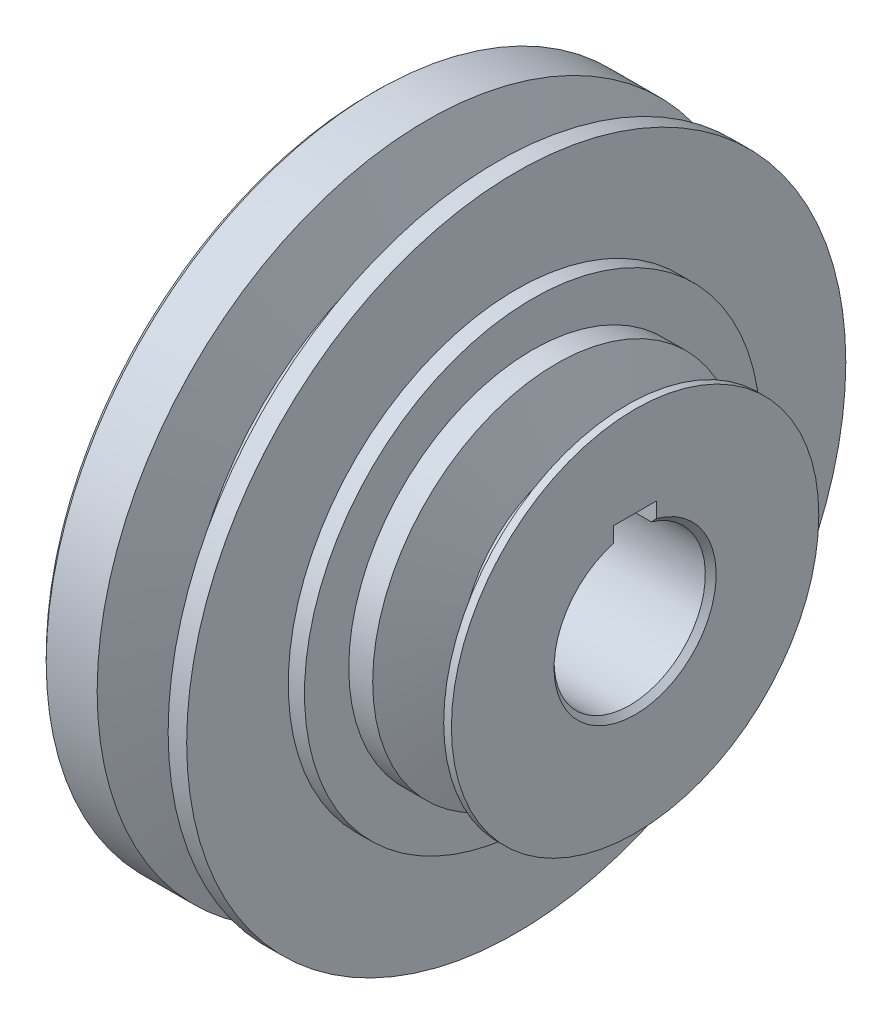
ISO-10303-21;
HEADER;
FILE_DESCRIPTION(('STEP AP214'),'2;1');
FILE_NAME('part.step','',(''),(''),'','','');
FILE_SCHEMA(('AUTOMOTIVE_DESIGN { 1 0 10303 214 1 1 1 1 }'));
ENDSEC;
DATA;
#1=APPLICATION_CONTEXT('core data for automotive mechanical design processes');
#2=APPLICATION_PROTOCOL_DEFINITION('international standard','automotive_design',2000,#1);
#3=PRODUCT_CONTEXT('',#1,'mechanical');
#4=PRODUCT('Part','Part','',(#3));
#5=PRODUCT_RELATED_PRODUCT_CATEGORY('part','',(#4));
#6=PRODUCT_DEFINITION_FORMATION('','',#4);
#7=PRODUCT_DEFINITION_CONTEXT('part definition',#1,'design');
#8=PRODUCT_DEFINITION('design','',#6,#7);
#9=PRODUCT_DEFINITION_SHAPE('','',#8);
#10=(LENGTH_UNIT() NAMED_UNIT(*) SI_UNIT(.MILLI.,.METRE.));
#11=(NAMED_UNIT(*) PLANE_ANGLE_UNIT() SI_UNIT($,.RADIAN.));
#12=(NAMED_UNIT(*) SI_UNIT($,.STERADIAN.) SOLID_ANGLE_UNIT());
#13=UNCERTAINTY_MEASURE_WITH_UNIT(LENGTH_MEASURE(1.E-05),#10,'distance_accuracy_value','');
#14=(GEOMETRIC_REPRESENTATION_CONTEXT(3) GLOBAL_UNCERTAINTY_ASSIGNED_CONTEXT((#13)) GLOBAL_UNIT_ASSIGNED_CONTEXT((#10,
#11,#12)) REPRESENTATION_CONTEXT('',''));
#15=CARTESIAN_POINT('',(0.,0.,0.));
#16=DIRECTION('',(0.,0.,1.));
#17=DIRECTION('',(1.,0.,0.));
#18=AXIS2_PLACEMENT_3D('',#15,#16,#17);
#19=CARTESIAN_POINT('',(32.,0.,0.));
#20=DIRECTION('',(-1.,0.,0.));
#21=DIRECTION('',(0.,0.,1.));
#22=AXIS2_PLACEMENT_3D('',#19,#20,#21);
#23=CYLINDRICAL_SURFACE('',#22,34.);
#24=CARTESIAN_POINT('',(13.,0.,0.));
#25=DIRECTION('',(1.,0.,0.));
#26=DIRECTION('',(0.,0.,-1.));
#27=AXIS2_PLACEMENT_3D('',#24,#25,#26);
#28=CIRCLE('',#27,34.);
#29=CARTESIAN_POINT('',(13.,0.,-34.));
#30=VERTEX_POINT('',#29);
#31=EDGE_CURVE('E198',#30,#30,#28,.T.);
#32=ORIENTED_EDGE('',*,*,#31,.T.);
#33=EDGE_LOOP('',(#32));
#34=FACE_BOUND('',#33,.T.);
#35=CARTESIAN_POINT('',(17.4299426148947,0.,0.));
#36=DIRECTION('',(-1.,0.,0.));
#37=DIRECTION('',(0.,0.,1.));
#38=AXIS2_PLACEMENT_3D('',#35,#36,#37);
#39=CIRCLE('',#38,34.);
#40=CARTESIAN_POINT('',(17.4299426148947,0.,34.));
#41=VERTEX_POINT('',#40);
#42=EDGE_CURVE('E189',#41,#41,#39,.T.);
#43=ORIENTED_EDGE('',*,*,#42,.T.);
#44=EDGE_LOOP('',(#43));
#45=FACE_BOUND('',#44,.T.);
#46=ADVANCED_FACE('F49',(#34,#45),#23,.T.);
#47=CARTESIAN_POINT('',(10.,0.,0.));
#48=DIRECTION('',(-1.,0.,0.));
#49=DIRECTION('',(0.,0.,1.));
#50=AXIS2_PLACEMENT_3D('',#47,#48,#49);
#51=CYLINDRICAL_SURFACE('',#50,61.);
#52=CARTESIAN_POINT('',(10.,0.,0.));
#53=DIRECTION('',(1.,0.,0.));
#54=DIRECTION('',(0.,0.,-1.));
#55=AXIS2_PLACEMENT_3D('',#52,#53,#54);
#56=CIRCLE('',#55,61.);
#57=CARTESIAN_POINT('',(10.,0.,-61.));
#58=VERTEX_POINT('',#57);
#59=EDGE_CURVE('E254',#58,#58,#56,.T.);
#60=ORIENTED_EDGE('',*,*,#59,.F.);
#61=EDGE_LOOP('',(#60));
#62=FACE_BOUND('',#61,.T.);
#63=CARTESIAN_POINT('',(6.57005738510532,0.,0.));
#64=DIRECTION('',(-1.,0.,0.));
#65=DIRECTION('',(0.,0.,1.));
#66=AXIS2_PLACEMENT_3D('',#63,#64,#65);
#67=CIRCLE('',#66,61.);
#68=CARTESIAN_POINT('',(6.57005738510532,0.,61.));
#69=VERTEX_POINT('',#68);
#70=EDGE_CURVE('E266',#69,#69,#67,.T.);
#71=ORIENTED_EDGE('',*,*,#70,.F.);
#72=EDGE_LOOP('',(#71));
#73=FACE_BOUND('',#72,.T.);
#74=ADVANCED_FACE('F311',(#62,#73),#51,.T.);
#75=CARTESIAN_POINT('',(10.,0.,0.));
#76=DIRECTION('',(1.,0.,0.));
#77=DIRECTION('',(0.,0.,-1.));
#78=AXIS2_PLACEMENT_3D('',#75,#76,#77);
#79=PLANE('',#78);
#80=CARTESIAN_POINT('',(10.,0.,0.));
#81=DIRECTION('',(1.,0.,0.));
#82=DIRECTION('',(0.,0.,-1.));
#83=AXIS2_PLACEMENT_3D('',#80,#81,#82);
#84=CIRCLE('',#83,42.1959290502496);
#85=CARTESIAN_POINT('',(10.,0.,-42.1959290502496));
#86=VERTEX_POINT('',#85);
#87=EDGE_CURVE('E202',#86,#86,#84,.T.);
#88=ORIENTED_EDGE('',*,*,#87,.F.);
#89=EDGE_LOOP('',(#88));
#90=FACE_BOUND('',#89,.T.);
#91=ORIENTED_EDGE('',*,*,#59,.T.);
#92=EDGE_LOOP('',(#91));
#93=FACE_BOUND('',#92,.T.);
#94=ADVANCED_FACE('F376',(#90,#93),#79,.T.);
#95=CARTESIAN_POINT('',(2.74842386687205,0.,0.));
#96=DIRECTION('',(1.,0.,0.));
#97=DIRECTION('',(0.,0.,-1.));
#98=AXIS2_PLACEMENT_3D('',#95,#96,#97);
#99=CONICAL_SURFACE('',#98,48.5,1.27409035395586);
#100=ORIENTED_EDGE('',*,*,#70,.T.);
#101=EDGE_LOOP('',(#100));
#102=FACE_BOUND('',#101,.T.);
#103=CARTESIAN_POINT('',(2.74842386687205,0.,0.));
#104=DIRECTION('',(-1.,0.,0.));
#105=DIRECTION('',(0.,0.,1.));
#106=AXIS2_PLACEMENT_3D('',#103,#104,#105);
#107=CIRCLE('',#106,48.5);
#108=CARTESIAN_POINT('',(2.74842386687205,0.,48.5));
#109=VERTEX_POINT('',#108);
#110=EDGE_CURVE('E262',#109,#109,#107,.T.);
#111=ORIENTED_EDGE('',*,*,#110,.F.);
#112=EDGE_LOOP('',(#111));
#113=FACE_BOUND('',#112,.T.);
#114=ADVANCED_FACE('F372',(#102,#113),#99,.T.);
#115=CARTESIAN_POINT('',(0.,0.,0.));
#116=DIRECTION('',(-1.,0.,0.));
#117=DIRECTION('',(0.,0.,1.));
#118=AXIS2_PLACEMENT_3D('',#115,#116,#117);
#119=CYLINDRICAL_SURFACE('',#118,48.5);
#120=ORIENTED_EDGE('',*,*,#110,.T.);
#121=EDGE_LOOP('',(#120));
#122=FACE_BOUND('',#121,.T.);
#123=CARTESIAN_POINT('',(-2.74842386687205,0.,0.));
#124=DIRECTION('',(-1.,0.,0.));
#125=DIRECTION('',(0.,0.,1.));
#126=AXIS2_PLACEMENT_3D('',#123,#124,#125);
#127=CIRCLE('',#126,48.5);
#128=CARTESIAN_POINT('',(-2.74842386687205,0.,48.5));
#129=VERTEX_POINT('',#128);
#130=EDGE_CURVE('E258',#129,#129,#127,.T.);
#131=ORIENTED_EDGE('',*,*,#130,.F.);
#132=EDGE_LOOP('',(#131));
#133=FACE_BOUND('',#132,.T.);
#134=ADVANCED_FACE('F368',(#122,#133),#119,.T.);
#135=CARTESIAN_POINT('',(-6.57005738510532,0.,0.));
#136=DIRECTION('',(-1.,0.,0.));
#137=DIRECTION('',(0.,0.,1.));
#138=AXIS2_PLACEMENT_3D('',#135,#136,#137);
#139=CONICAL_SURFACE('',#138,61.,1.27409035395586);
#140=ORIENTED_EDGE('',*,*,#130,.T.);
#141=EDGE_LOOP('',(#140));
#142=FACE_BOUND('',#141,.T.);
#143=CARTESIAN_POINT('',(-6.57005738510532,0.,0.));
#144=DIRECTION('',(-1.,0.,0.));
#145=DIRECTION('',(0.,0.,1.));
#146=AXIS2_PLACEMENT_3D('',#143,#144,#145);
#147=CIRCLE('',#146,61.);
#148=CARTESIAN_POINT('',(-6.57005738510532,0.,61.));
#149=VERTEX_POINT('',#148);
#150=EDGE_CURVE('E250',#149,#149,#147,.T.);
#151=ORIENTED_EDGE('',*,*,#150,.F.);
#152=EDGE_LOOP('',(#151));
#153=FACE_BOUND('',#152,.T.);
#154=ADVANCED_FACE('F364',(#142,#153),#139,.T.);
#155=CARTESIAN_POINT('',(-17.,0.,0.));
#156=DIRECTION('',(1.,0.,0.));
#157=DIRECTION('',(0.,0.,-1.));
#158=AXIS2_PLACEMENT_3D('',#155,#156,#157);
#159=PLANE('',#158);
#160=CARTESIAN_POINT('',(-17.,0.,0.));
#161=DIRECTION('',(1.,0.,0.));
#162=DIRECTION('',(0.,0.,-1.));
#163=AXIS2_PLACEMENT_3D('',#160,#161,#162);
#164=CIRCLE('',#163,60.);
#165=CARTESIAN_POINT('',(-17.,0.,-60.));
#166=VERTEX_POINT('',#165);
#167=EDGE_CURVE('E11',#166,#166,#164,.F.);
#168=ORIENTED_EDGE('',*,*,#167,.T.);
#169=EDGE_LOOP('',(#168));
#170=FACE_BOUND('',#169,.T.);
#171=CARTESIAN_POINT('',(-17.,36.5,0.));
#172=DIRECTION('',(-1.,0.,0.));
#173=DIRECTION('',(0.,0.,1.));
#174=AXIS2_PLACEMENT_3D('',#171,#172,#173);
#175=CIRCLE('',#174,4.24999999999999);
#176=CARTESIAN_POINT('',(-17.,36.5,4.24999999999999));
#177=VERTEX_POINT('',#176);
#178=EDGE_CURVE('E206',#177,#177,#175,.T.);
#179=ORIENTED_EDGE('',*,*,#178,.F.);
#180=EDGE_LOOP('',(#179));
#181=FACE_BOUND('',#180,.T.);
#182=CARTESIAN_POINT('',(-17.,-36.5,0.));
#183=DIRECTION('',(-1.,0.,0.));
#184=DIRECTION('',(0.,0.,1.));
#185=AXIS2_PLACEMENT_3D('',#182,#183,#184);
#186=CIRCLE('',#185,4.24999999999999);
#187=CARTESIAN_POINT('',(-17.,-36.5,4.24999999999999));
#188=VERTEX_POINT('',#187);
#189=EDGE_CURVE('E218',#188,#188,#186,.T.);
#190=ORIENTED_EDGE('',*,*,#189,.F.);
#191=EDGE_LOOP('',(#190));
#192=FACE_BOUND('',#191,.T.);
#193=CARTESIAN_POINT('',(-17.,0.,0.));
#194=DIRECTION('',(-1.,0.,0.));
#195=DIRECTION('',(0.,0.,1.));
#196=AXIS2_PLACEMENT_3D('',#193,#194,#195);
#197=CIRCLE('',#196,25.);
#198=CARTESIAN_POINT('',(-17.,0.,25.));
#199=VERTEX_POINT('',#198);
#200=EDGE_CURVE('E246',#199,#199,#197,.T.);
#201=ORIENTED_EDGE('',*,*,#200,.F.);
#202=EDGE_LOOP('',(#201));
#203=FACE_BOUND('',#202,.T.);
#204=ADVANCED_FACE('F367',(#170,#181,#192,#203),#159,.F.);
#205=CARTESIAN_POINT('',(-16.,0.,0.));
#206=DIRECTION('',(1.,0.,0.));
#207=DIRECTION('',(0.,0.,-1.));
#208=AXIS2_PLACEMENT_3D('',#205,#206,#207);
#209=CIRCLE('',#208,61.);
#210=CARTESIAN_POINT('',(-16.,0.,-61.));
#211=VERTEX_POINT('',#210);
#212=EDGE_CURVE('E59',#211,#211,#209,.T.);
#213=ORIENTED_EDGE('',*,*,#212,.T.);
#214=EDGE_LOOP('',(#213));
#215=FACE_BOUND('',#214,.T.);
#216=ORIENTED_EDGE('',*,*,#150,.T.);
#217=EDGE_LOOP('',(#216));
#218=FACE_BOUND('',#217,.T.);
#219=ADVANCED_FACE('F362',(#215,#218),#51,.T.);
#220=CARTESIAN_POINT('',(-36.,0.,0.));
#221=DIRECTION('',(1.,0.,0.));
#222=DIRECTION('',(0.,0.,-1.));
#223=AXIS2_PLACEMENT_3D('',#220,#221,#222);
#224=CYLINDRICAL_SURFACE('',#223,25.);
#225=CARTESIAN_POINT('',(-36.,0.,0.));
#226=DIRECTION('',(-1.,0.,0.));
#227=DIRECTION('',(0.,0.,1.));
#228=AXIS2_PLACEMENT_3D('',#225,#226,#227);
#229=CIRCLE('',#228,25.);
#230=CARTESIAN_POINT('',(-36.,0.,25.));
#231=VERTEX_POINT('',#230);
#232=EDGE_CURVE('E242',#231,#231,#229,.T.);
#233=ORIENTED_EDGE('',*,*,#232,.F.);
#234=EDGE_LOOP('',(#233));
#235=FACE_BOUND('',#234,.T.);
#236=ORIENTED_EDGE('',*,*,#200,.T.);
#237=EDGE_LOOP('',(#236));
#238=FACE_BOUND('',#237,.T.);
#239=ADVANCED_FACE('F358',(#235,#238),#224,.T.);
#240=CARTESIAN_POINT('',(-36.,0.,0.));
#241=DIRECTION('',(-1.,0.,0.));
#242=DIRECTION('',(0.,0.,1.));
#243=AXIS2_PLACEMENT_3D('',#240,#241,#242);
#244=PLANE('',#243);
#245=CARTESIAN_POINT('',(-36.,0.,0.));
#246=DIRECTION('',(-1.,0.,0.));
#247=DIRECTION('',(0.,0.,1.));
#248=AXIS2_PLACEMENT_3D('',#245,#246,#247);
#249=CIRCLE('',#248,21.);
#250=CARTESIAN_POINT('',(-36.,0.,21.));
#251=VERTEX_POINT('',#250);
#252=EDGE_CURVE('E210',#251,#251,#249,.T.);
#253=ORIENTED_EDGE('',*,*,#252,.F.);
#254=EDGE_LOOP('',(#253));
#255=FACE_BOUND('',#254,.T.);
#256=ORIENTED_EDGE('',*,*,#232,.T.);
#257=EDGE_LOOP('',(#256));
#258=FACE_BOUND('',#257,.T.);
#259=ADVANCED_FACE('F354',(#255,#258),#244,.T.);
#260=CARTESIAN_POINT('',(-42.,0.,0.));
#261=DIRECTION('',(1.,0.,0.));
#262=DIRECTION('',(0.,0.,-1.));
#263=AXIS2_PLACEMENT_3D('',#260,#261,#262);
#264=CYLINDRICAL_SURFACE('',#263,21.);
#265=CARTESIAN_POINT('',(-42.,0.,0.));
#266=DIRECTION('',(-1.,0.,0.));
#267=DIRECTION('',(0.,0.,1.));
#268=AXIS2_PLACEMENT_3D('',#265,#266,#267);
#269=CIRCLE('',#268,21.);
#270=CARTESIAN_POINT('',(-42.,0.,21.));
#271=VERTEX_POINT('',#270);
#272=EDGE_CURVE('E235',#271,#271,#269,.T.);
#273=ORIENTED_EDGE('',*,*,#272,.F.);
#274=EDGE_LOOP('',(#273));
#275=FACE_BOUND('',#274,.T.);
#276=ORIENTED_EDGE('',*,*,#252,.T.);
#277=EDGE_LOOP('',(#276));
#278=FACE_BOUND('',#277,.T.);
#279=ADVANCED_FACE('F350',(#275,#278),#264,.T.);
#280=CARTESIAN_POINT('',(-42.,0.,0.));
#281=DIRECTION('',(-1.,0.,0.));
#282=DIRECTION('',(0.,0.,1.));
#283=AXIS2_PLACEMENT_3D('',#280,#281,#282);
#284=PLANE('',#283);
#285=DIRECTION('',(0.,1.,0.));
#286=VECTOR('',#285,1.);
#287=CARTESIAN_POINT('',(-42.,17.3,4.));
#288=LINE('',#287,#286);
#289=CARTESIAN_POINT('',(-42.,15.6984075625523,4.));
#290=VERTEX_POINT('',#289);
#291=CARTESIAN_POINT('',(-42.,17.3,4.));
#292=VERTEX_POINT('',#291);
#293=EDGE_CURVE('E132',#290,#292,#288,.T.);
#294=ORIENTED_EDGE('',*,*,#293,.F.);
#295=CARTESIAN_POINT('',(-42.,0.,0.));
#296=DIRECTION('',(-1.,0.,0.));
#297=DIRECTION('',(0.,0.,1.));
#298=AXIS2_PLACEMENT_3D('',#295,#296,#297);
#299=CIRCLE('',#298,16.2);
#300=CARTESIAN_POINT('',(-42.,15.6984075625523,-4.));
#301=VERTEX_POINT('',#300);
#302=EDGE_CURVE('E230',#301,#290,#299,.T.);
#303=ORIENTED_EDGE('',*,*,#302,.F.);
#304=DIRECTION('',(0.,-1.,0.));
#305=VECTOR('',#304,1.);
#306=CARTESIAN_POINT('',(-42.,17.3,-4.));
#307=LINE('',#306,#305);
#308=CARTESIAN_POINT('',(-42.,17.3,-4.));
#309=VERTEX_POINT('',#308);
#310=EDGE_CURVE('E126',#309,#301,#307,.T.);
#311=ORIENTED_EDGE('',*,*,#310,.F.);
#312=DIRECTION('',(0.,0.,-1.));
#313=VECTOR('',#312,1.);
#314=CARTESIAN_POINT('',(-42.,17.3,-4.));
#315=LINE('',#314,#313);
#316=EDGE_CURVE('E149',#292,#309,#315,.T.);
#317=ORIENTED_EDGE('',*,*,#316,.F.);
#318=EDGE_LOOP('',(#294,#303,#311,#317));
#319=FACE_BOUND('',#318,.T.);
#320=ORIENTED_EDGE('',*,*,#272,.T.);
#321=EDGE_LOOP('',(#320));
#322=FACE_BOUND('',#321,.T.);
#323=ADVANCED_FACE('F346',(#319,#322),#284,.T.);
#324=CARTESIAN_POINT('',(-31.,0.,0.));
#325=DIRECTION('',(-1.,0.,0.));
#326=DIRECTION('',(0.,0.,1.));
#327=AXIS2_PLACEMENT_3D('',#324,#325,#326);
#328=CYLINDRICAL_SURFACE('',#327,16.2);
#329=ORIENTED_EDGE('',*,*,#302,.T.);
#330=DIRECTION('',(-1.,0.,0.));
#331=VECTOR('',#330,1.);
#332=CARTESIAN_POINT('',(-31.,15.6984075625523,4.));
#333=LINE('',#332,#331);
#334=CARTESIAN_POINT('',(-31.,15.6984075625523,4.));
#335=VERTEX_POINT('',#334);
#336=EDGE_CURVE('E173',#290,#335,#333,.F.);
#337=ORIENTED_EDGE('',*,*,#336,.T.);
#338=CARTESIAN_POINT('',(-31.,0.,0.));
#339=DIRECTION('',(-1.,0.,0.));
#340=DIRECTION('',(0.,0.,1.));
#341=AXIS2_PLACEMENT_3D('',#338,#339,#340);
#342=CIRCLE('',#341,16.2);
#343=CARTESIAN_POINT('',(-31.,15.6984075625523,-4.));
#344=VERTEX_POINT('',#343);
#345=EDGE_CURVE('E231',#344,#335,#342,.T.);
#346=ORIENTED_EDGE('',*,*,#345,.F.);
#347=DIRECTION('',(-1.,0.,0.));
#348=VECTOR('',#347,1.);
#349=CARTESIAN_POINT('',(-31.,15.6984075625523,-4.));
#350=LINE('',#349,#348);
#351=EDGE_CURVE('E166',#344,#301,#350,.T.);
#352=ORIENTED_EDGE('',*,*,#351,.T.);
#353=EDGE_LOOP('',(#329,#337,#346,#352));
#354=FACE_BOUND('',#353,.T.);
#355=ADVANCED_FACE('F342',(#354),#328,.F.);
#356=CARTESIAN_POINT('',(-31.,0.,0.));
#357=DIRECTION('',(-1.,0.,0.));
#358=DIRECTION('',(0.,0.,1.));
#359=AXIS2_PLACEMENT_3D('',#356,#357,#358);
#360=PLANE('',#359);
#361=DIRECTION('',(0.,1.,0.));
#362=VECTOR('',#361,1.);
#363=CARTESIAN_POINT('',(-31.,0.,4.));
#364=LINE('',#363,#362);
#365=CARTESIAN_POINT('',(-31.,13.4164078649987,4.00000000000001));
#366=VERTEX_POINT('',#365);
#367=EDGE_CURVE('E170',#366,#335,#364,.T.);
#368=ORIENTED_EDGE('',*,*,#367,.F.);
#369=CARTESIAN_POINT('',(-31.,0.,0.));
#370=DIRECTION('',(-1.,0.,0.));
#371=DIRECTION('',(0.,0.,1.));
#372=AXIS2_PLACEMENT_3D('',#369,#370,#371);
#373=CIRCLE('',#372,14.);
#374=CARTESIAN_POINT('',(-31.,13.4164078649987,-4.));
#375=VERTEX_POINT('',#374);
#376=EDGE_CURVE('E226',#375,#366,#373,.T.);
#377=ORIENTED_EDGE('',*,*,#376,.F.);
#378=DIRECTION('',(0.,-1.,0.));
#379=VECTOR('',#378,1.);
#380=CARTESIAN_POINT('',(-31.,0.,-4.));
#381=LINE('',#380,#379);
#382=EDGE_CURVE('E157',#344,#375,#381,.T.);
#383=ORIENTED_EDGE('',*,*,#382,.F.);
#384=ORIENTED_EDGE('',*,*,#345,.T.);
#385=EDGE_LOOP('',(#368,#377,#383,#384));
#386=FACE_BOUND('',#385,.T.);
#387=ADVANCED_FACE('F339',(#386),#360,.T.);
#388=CARTESIAN_POINT('',(10.,0.,0.));
#389=DIRECTION('',(-1.,0.,0.));
#390=DIRECTION('',(0.,0.,1.));
#391=AXIS2_PLACEMENT_3D('',#388,#389,#390);
#392=CYLINDRICAL_SURFACE('',#391,14.);
#393=DIRECTION('',(-1.,0.,0.));
#394=VECTOR('',#393,1.);
#395=CARTESIAN_POINT('',(32.,13.4164078649987,4.00000000000001));
#396=LINE('',#395,#394);
#397=CARTESIAN_POINT('',(31.,13.4164078649987,4.00000000000001));
#398=VERTEX_POINT('',#397);
#399=EDGE_CURVE('E154',#398,#366,#396,.T.);
#400=ORIENTED_EDGE('',*,*,#399,.F.);
#401=CARTESIAN_POINT('',(31.,0.,0.));
#402=DIRECTION('',(1.,0.,0.));
#403=DIRECTION('',(0.,0.,-1.));
#404=AXIS2_PLACEMENT_3D('',#401,#402,#403);
#405=CIRCLE('',#404,14.);
#406=CARTESIAN_POINT('',(31.,13.4164078649987,-4.));
#407=VERTEX_POINT('',#406);
#408=EDGE_CURVE('E66',#398,#407,#405,.T.);
#409=ORIENTED_EDGE('',*,*,#408,.T.);
#410=DIRECTION('',(-1.,0.,0.));
#411=VECTOR('',#410,1.);
#412=CARTESIAN_POINT('',(32.,13.4164078649987,-4.));
#413=LINE('',#412,#411);
#414=EDGE_CURVE('E158',#407,#375,#413,.T.);
#415=ORIENTED_EDGE('',*,*,#414,.T.);
#416=ORIENTED_EDGE('',*,*,#376,.T.);
#417=EDGE_LOOP('',(#400,#409,#415,#416));
#418=FACE_BOUND('',#417,.T.);
#419=ADVANCED_FACE('F335',(#418),#392,.F.);
#420=CARTESIAN_POINT('',(0.446342369132872,-36.5,0.));
#421=DIRECTION('',(-1.,0.,0.));
#422=DIRECTION('',(0.,0.,1.));
#423=AXIS2_PLACEMENT_3D('',#420,#421,#422);
#424=CONICAL_SURFACE('',#423,4.25,1.02974425867665);
#425=CARTESIAN_POINT('',(3.,-36.5,0.));
#426=VERTEX_POINT('',#425);
#427=VERTEX_LOOP('',#426);
#428=FACE_BOUND('',#427,.T.);
#429=CARTESIAN_POINT('',(0.446342369132872,-36.5,0.));
#430=DIRECTION('',(-1.,0.,0.));
#431=DIRECTION('',(0.,0.,1.));
#432=AXIS2_PLACEMENT_3D('',#429,#430,#431);
#433=CIRCLE('',#432,4.25);
#434=CARTESIAN_POINT('',(0.446342369132872,-36.5,4.25));
#435=VERTEX_POINT('',#434);
#436=EDGE_CURVE('E222',#435,#435,#433,.T.);
#437=ORIENTED_EDGE('',*,*,#436,.T.);
#438=EDGE_LOOP('',(#437));
#439=FACE_BOUND('',#438,.T.);
#440=ADVANCED_FACE('F331',(#428,#439),#424,.F.);
#441=CARTESIAN_POINT('',(-17.,-36.5,0.));
#442=DIRECTION('',(-1.,0.,0.));
#443=DIRECTION('',(0.,0.,1.));
#444=AXIS2_PLACEMENT_3D('',#441,#442,#443);
#445=CYLINDRICAL_SURFACE('',#444,4.24999999999999);
#446=ORIENTED_EDGE('',*,*,#436,.F.);
#447=EDGE_LOOP('',(#446));
#448=FACE_BOUND('',#447,.T.);
#449=ORIENTED_EDGE('',*,*,#189,.T.);
#450=EDGE_LOOP('',(#449));
#451=FACE_BOUND('',#450,.T.);
#452=ADVANCED_FACE('F327',(#448,#451),#445,.F.);
#453=CARTESIAN_POINT('',(0.446342369132872,36.5,0.));
#454=DIRECTION('',(-1.,0.,0.));
#455=DIRECTION('',(0.,0.,1.));
#456=AXIS2_PLACEMENT_3D('',#453,#454,#455);
#457=CONICAL_SURFACE('',#456,4.25,1.02974425867665);
#458=CARTESIAN_POINT('',(3.,36.5,0.));
#459=VERTEX_POINT('',#458);
#460=VERTEX_LOOP('',#459);
#461=FACE_BOUND('',#460,.T.);
#462=CARTESIAN_POINT('',(0.446342369132872,36.5,0.));
#463=DIRECTION('',(-1.,0.,0.));
#464=DIRECTION('',(0.,0.,1.));
#465=AXIS2_PLACEMENT_3D('',#462,#463,#464);
#466=CIRCLE('',#465,4.25);
#467=CARTESIAN_POINT('',(0.446342369132872,36.5,4.25));
#468=VERTEX_POINT('',#467);
#469=EDGE_CURVE('E214',#468,#468,#466,.T.);
#470=ORIENTED_EDGE('',*,*,#469,.T.);
#471=EDGE_LOOP('',(#470));
#472=FACE_BOUND('',#471,.T.);
#473=ADVANCED_FACE('F323',(#461,#472),#457,.F.);
#474=CARTESIAN_POINT('',(-17.,36.5,0.));
#475=DIRECTION('',(-1.,0.,0.));
#476=DIRECTION('',(0.,0.,1.));
#477=AXIS2_PLACEMENT_3D('',#474,#475,#476);
#478=CYLINDRICAL_SURFACE('',#477,4.24999999999999);
#479=ORIENTED_EDGE('',*,*,#469,.F.);
#480=EDGE_LOOP('',(#479));
#481=FACE_BOUND('',#480,.T.);
#482=ORIENTED_EDGE('',*,*,#178,.T.);
#483=EDGE_LOOP('',(#482));
#484=FACE_BOUND('',#483,.T.);
#485=ADVANCED_FACE('F316',(#481,#484),#478,.F.);
#486=CARTESIAN_POINT('',(13.,0.,0.));
#487=DIRECTION('',(1.,0.,0.));
#488=DIRECTION('',(0.,0.,-1.));
#489=AXIS2_PLACEMENT_3D('',#486,#487,#488);
#490=PLANE('',#489);
#491=ORIENTED_EDGE('',*,*,#31,.F.);
#492=EDGE_LOOP('',(#491));
#493=FACE_BOUND('',#492,.T.);
#494=CARTESIAN_POINT('',(13.,0.,0.));
#495=DIRECTION('',(1.,0.,0.));
#496=DIRECTION('',(0.,0.,-1.));
#497=AXIS2_PLACEMENT_3D('',#494,#495,#496);
#498=CIRCLE('',#497,42.1959290502496);
#499=CARTESIAN_POINT('',(13.,0.,-42.1959290502496));
#500=VERTEX_POINT('',#499);
#501=EDGE_CURVE('E197',#500,#500,#498,.T.);
#502=ORIENTED_EDGE('',*,*,#501,.T.);
#503=EDGE_LOOP('',(#502));
#504=FACE_BOUND('',#503,.T.);
#505=ADVANCED_FACE('F313',(#493,#504),#490,.T.);
#506=CARTESIAN_POINT('',(13.,0.,0.));
#507=DIRECTION('',(-1.,0.,0.));
#508=DIRECTION('',(0.,0.,1.));
#509=AXIS2_PLACEMENT_3D('',#506,#507,#508);
#510=CYLINDRICAL_SURFACE('',#509,42.1959290502496);
#511=ORIENTED_EDGE('',*,*,#501,.F.);
#512=EDGE_LOOP('',(#511));
#513=FACE_BOUND('',#512,.T.);
#514=ORIENTED_EDGE('',*,*,#87,.T.);
#515=EDGE_LOOP('',(#514));
#516=FACE_BOUND('',#515,.T.);
#517=ADVANCED_FACE('F305',(#513,#516),#510,.T.);
#518=CARTESIAN_POINT('',(17.4299426148947,0.,0.));
#519=DIRECTION('',(-1.,0.,0.));
#520=DIRECTION('',(0.,0.,1.));
#521=AXIS2_PLACEMENT_3D('',#518,#519,#520);
#522=CONICAL_SURFACE('',#521,34.,1.27409035395586);
#523=CARTESIAN_POINT('',(21.251576133128,0.,0.));
#524=DIRECTION('',(-1.,0.,0.));
#525=DIRECTION('',(0.,0.,1.));
#526=AXIS2_PLACEMENT_3D('',#523,#524,#525);
#527=CIRCLE('',#526,21.5);
#528=CARTESIAN_POINT('',(21.251576133128,0.,21.5));
#529=VERTEX_POINT('',#528);
#530=EDGE_CURVE('E177',#529,#529,#527,.T.);
#531=ORIENTED_EDGE('',*,*,#530,.T.);
#532=EDGE_LOOP('',(#531));
#533=FACE_BOUND('',#532,.T.);
#534=ORIENTED_EDGE('',*,*,#42,.F.);
#535=EDGE_LOOP('',(#534));
#536=FACE_BOUND('',#535,.T.);
#537=ADVANCED_FACE('F301',(#533,#536),#522,.T.);
#538=CARTESIAN_POINT('',(26.748423866872,0.,0.));
#539=DIRECTION('',(1.,0.,0.));
#540=DIRECTION('',(0.,0.,-1.));
#541=AXIS2_PLACEMENT_3D('',#538,#539,#540);
#542=CONICAL_SURFACE('',#541,21.5,1.27409035395586);
#543=CARTESIAN_POINT('',(30.5700573851053,0.,0.));
#544=DIRECTION('',(-1.,0.,0.));
#545=DIRECTION('',(0.,0.,1.));
#546=AXIS2_PLACEMENT_3D('',#543,#544,#545);
#547=CIRCLE('',#546,34.);
#548=CARTESIAN_POINT('',(30.5700573851053,0.,34.));
#549=VERTEX_POINT('',#548);
#550=EDGE_CURVE('E185',#549,#549,#547,.T.);
#551=ORIENTED_EDGE('',*,*,#550,.T.);
#552=EDGE_LOOP('',(#551));
#553=FACE_BOUND('',#552,.T.);
#554=CARTESIAN_POINT('',(26.748423866872,0.,0.));
#555=DIRECTION('',(-1.,0.,0.));
#556=DIRECTION('',(0.,0.,1.));
#557=AXIS2_PLACEMENT_3D('',#554,#555,#556);
#558=CIRCLE('',#557,21.5);
#559=CARTESIAN_POINT('',(26.748423866872,0.,21.5));
#560=VERTEX_POINT('',#559);
#561=EDGE_CURVE('E181',#560,#560,#558,.T.);
#562=ORIENTED_EDGE('',*,*,#561,.F.);
#563=EDGE_LOOP('',(#562));
#564=FACE_BOUND('',#563,.T.);
#565=ADVANCED_FACE('F297',(#553,#564),#542,.T.);
#566=CARTESIAN_POINT('',(0.,0.,0.));
#567=DIRECTION('',(-1.,0.,0.));
#568=DIRECTION('',(0.,0.,1.));
#569=AXIS2_PLACEMENT_3D('',#566,#567,#568);
#570=CYLINDRICAL_SURFACE('',#569,21.5);
#571=ORIENTED_EDGE('',*,*,#561,.T.);
#572=EDGE_LOOP('',(#571));
#573=FACE_BOUND('',#572,.T.);
#574=ORIENTED_EDGE('',*,*,#530,.F.);
#575=EDGE_LOOP('',(#574));
#576=FACE_BOUND('',#575,.T.);
#577=ADVANCED_FACE('F294',(#573,#576),#570,.T.);
#578=CARTESIAN_POINT('',(32.,0.,0.));
#579=DIRECTION('',(1.,0.,0.));
#580=DIRECTION('',(0.,0.,-1.));
#581=AXIS2_PLACEMENT_3D('',#578,#579,#580);
#582=PLANE('',#581);
#583=DIRECTION('',(0.,-1.,0.));
#584=VECTOR('',#583,1.);
#585=CARTESIAN_POINT('',(32.,17.3,-4.));
#586=LINE('',#585,#584);
#587=CARTESIAN_POINT('',(32.,17.3,-4.));
#588=VERTEX_POINT('',#587);
#589=CARTESIAN_POINT('',(32.,14.456832294801,-4.));
#590=VERTEX_POINT('',#589);
#591=EDGE_CURVE('E138',#588,#590,#586,.T.);
#592=ORIENTED_EDGE('',*,*,#591,.T.);
#593=CARTESIAN_POINT('',(32.,0.,0.));
#594=DIRECTION('',(1.,0.,0.));
#595=DIRECTION('',(0.,0.,-1.));
#596=AXIS2_PLACEMENT_3D('',#593,#594,#595);
#597=CIRCLE('',#596,15.);
#598=CARTESIAN_POINT('',(32.,14.456832294801,4.));
#599=VERTEX_POINT('',#598);
#600=EDGE_CURVE('E124',#590,#599,#597,.F.);
#601=ORIENTED_EDGE('',*,*,#600,.T.);
#602=DIRECTION('',(0.,1.,0.));
#603=VECTOR('',#602,1.);
#604=CARTESIAN_POINT('',(32.,17.3,4.));
#605=LINE('',#604,#603);
#606=CARTESIAN_POINT('',(32.,17.3,4.));
#607=VERTEX_POINT('',#606);
#608=EDGE_CURVE('E116',#599,#607,#605,.T.);
#609=ORIENTED_EDGE('',*,*,#608,.T.);
#610=DIRECTION('',(0.,0.,-1.));
#611=VECTOR('',#610,1.);
#612=CARTESIAN_POINT('',(32.,17.3,-4.));
#613=LINE('',#612,#611);
#614=EDGE_CURVE('E122',#607,#588,#613,.T.);
#615=ORIENTED_EDGE('',*,*,#614,.T.);
#616=EDGE_LOOP('',(#592,#601,#609,#615));
#617=FACE_BOUND('',#616,.T.);
#618=CARTESIAN_POINT('',(32.,0.,0.));
#619=DIRECTION('',(1.,0.,0.));
#620=DIRECTION('',(0.,0.,-1.));
#621=AXIS2_PLACEMENT_3D('',#618,#619,#620);
#622=CIRCLE('',#621,34.);
#623=CARTESIAN_POINT('',(32.,0.,-34.));
#624=VERTEX_POINT('',#623);
#625=EDGE_CURVE('E193',#624,#624,#622,.T.);
#626=ORIENTED_EDGE('',*,*,#625,.T.);
#627=EDGE_LOOP('',(#626));
#628=FACE_BOUND('',#627,.T.);
#629=ADVANCED_FACE('F119',(#617,#628),#582,.T.);
#630=ORIENTED_EDGE('',*,*,#625,.F.);
#631=EDGE_LOOP('',(#630));
#632=FACE_BOUND('',#631,.T.);
#633=ORIENTED_EDGE('',*,*,#550,.F.);
#634=EDGE_LOOP('',(#633));
#635=FACE_BOUND('',#634,.T.);
#636=ADVANCED_FACE('F292',(#632,#635),#23,.T.);
#637=CARTESIAN_POINT('',(32.,17.3,4.));
#638=DIRECTION('',(0.,0.,1.));
#639=DIRECTION('',(1.,0.,0.));
#640=AXIS2_PLACEMENT_3D('',#637,#638,#639);
#641=PLANE('',#640);
#642=ORIENTED_EDGE('',*,*,#608,.F.);
#643=CARTESIAN_POINT('',(32.,14.456832294801,4.));
#644=CARTESIAN_POINT('',(31.833086928009,14.2836650605188,4.));
#645=CARTESIAN_POINT('',(31.6662970601287,14.1103794090722,4.));
#646=CARTESIAN_POINT('',(31.3329637267868,13.7635712658131,4.));
#647=CARTESIAN_POINT('',(31.1664202613338,13.5900487739922,4.));
#648=CARTESIAN_POINT('',(31.,13.4164078649987,4.));
#649=B_SPLINE_CURVE_WITH_KNOTS('',3,(#643,#644,#645,#646,#647,#648),.UNSPECIFIED.,.F.,.F.,(4,2,
4),(0.,0.721540707945885,1.44308144101328),.UNSPECIFIED.);
#650=EDGE_CURVE('E74',#599,#398,#649,.T.);
#651=ORIENTED_EDGE('',*,*,#650,.T.);
#652=ORIENTED_EDGE('',*,*,#399,.T.);
#653=ORIENTED_EDGE('',*,*,#367,.T.);
#654=ORIENTED_EDGE('',*,*,#336,.F.);
#655=ORIENTED_EDGE('',*,*,#293,.T.);
#656=DIRECTION('',(-1.,0.,0.));
#657=VECTOR('',#656,1.);
#658=CARTESIAN_POINT('',(32.,17.3,4.));
#659=LINE('',#658,#657);
#660=EDGE_CURVE('E129',#607,#292,#659,.T.);
#661=ORIENTED_EDGE('',*,*,#660,.F.);
#662=EDGE_LOOP('',(#642,#651,#652,#653,#654,#655,#661));
#663=FACE_BOUND('',#662,.T.);
#664=ADVANCED_FACE('F130',(#663),#641,.F.);
#665=CARTESIAN_POINT('',(32.,17.3,-4.));
#666=DIRECTION('',(0.,0.,-1.));
#667=DIRECTION('',(-1.,0.,0.));
#668=AXIS2_PLACEMENT_3D('',#665,#666,#667);
#669=PLANE('',#668);
#670=ORIENTED_EDGE('',*,*,#414,.F.);
#671=CARTESIAN_POINT('',(31.,13.4164078649987,-4.));
#672=CARTESIAN_POINT('',(31.1664202613338,13.5900487739922,-4.));
#673=CARTESIAN_POINT('',(31.3329637267868,13.7635712658131,-4.));
#674=CARTESIAN_POINT('',(31.6662970601287,14.1103794090722,-4.));
#675=CARTESIAN_POINT('',(31.833086928009,14.2836650605188,-4.));
#676=CARTESIAN_POINT('',(32.,14.456832294801,-4.));
#677=B_SPLINE_CURVE_WITH_KNOTS('',3,(#671,#672,#673,#674,#675,#676),.UNSPECIFIED.,.F.,.F.,(4,2,
4),(0.,0.721540733067394,1.44308144101328),.UNSPECIFIED.);
#678=EDGE_CURVE('E400',#407,#590,#677,.T.);
#679=ORIENTED_EDGE('',*,*,#678,.T.);
#680=ORIENTED_EDGE('',*,*,#591,.F.);
#681=DIRECTION('',(-1.,0.,0.));
#682=VECTOR('',#681,1.);
#683=CARTESIAN_POINT('',(32.,17.3,-4.));
#684=LINE('',#683,#682);
#685=EDGE_CURVE('E137',#588,#309,#684,.T.);
#686=ORIENTED_EDGE('',*,*,#685,.T.);
#687=ORIENTED_EDGE('',*,*,#310,.T.);
#688=ORIENTED_EDGE('',*,*,#351,.F.);
#689=ORIENTED_EDGE('',*,*,#382,.T.);
#690=EDGE_LOOP('',(#670,#679,#680,#686,#687,#688,#689));
#691=FACE_BOUND('',#690,.T.);
#692=ADVANCED_FACE('F291',(#691),#669,.F.);
#693=CARTESIAN_POINT('',(32.,17.3,-4.));
#694=DIRECTION('',(0.,1.,0.));
#695=DIRECTION('',(0.,0.,1.));
#696=AXIS2_PLACEMENT_3D('',#693,#694,#695);
#697=PLANE('',#696);
#698=ORIENTED_EDGE('',*,*,#316,.T.);
#699=ORIENTED_EDGE('',*,*,#685,.F.);
#700=ORIENTED_EDGE('',*,*,#614,.F.);
#701=ORIENTED_EDGE('',*,*,#660,.T.);
#702=EDGE_LOOP('',(#698,#699,#700,#701));
#703=FACE_BOUND('',#702,.T.);
#704=ADVANCED_FACE('F141',(#703),#697,.F.);
#705=CARTESIAN_POINT('',(32.,0.,0.));
#706=DIRECTION('',(1.,0.,0.));
#707=DIRECTION('',(0.,0.,-1.));
#708=AXIS2_PLACEMENT_3D('',#705,#706,#707);
#709=CONICAL_SURFACE('',#708,15.,0.785398163397458);
#710=ORIENTED_EDGE('',*,*,#678,.F.);
#711=ORIENTED_EDGE('',*,*,#408,.F.);
#712=ORIENTED_EDGE('',*,*,#650,.F.);
#713=ORIENTED_EDGE('',*,*,#600,.F.);
#714=EDGE_LOOP('',(#710,#711,#712,#713));
#715=FACE_BOUND('',#714,.T.);
#716=ADVANCED_FACE('F284',(#715),#709,.F.);
#717=CARTESIAN_POINT('',(-16.,0.,0.));
#718=DIRECTION('',(1.,0.,0.));
#719=DIRECTION('',(0.,0.,-1.));
#720=AXIS2_PLACEMENT_3D('',#717,#718,#719);
#721=CONICAL_SURFACE('',#720,61.,0.785398163397438);
#722=ORIENTED_EDGE('',*,*,#167,.F.);
#723=EDGE_LOOP('',(#722));
#724=FACE_BOUND('',#723,.T.);
#725=ORIENTED_EDGE('',*,*,#212,.F.);
#726=EDGE_LOOP('',(#725));
#727=FACE_BOUND('',#726,.T.);
#728=ADVANCED_FACE('F52',(#724,#727),#721,.T.);
#729=CLOSED_SHELL('',(#46,#74,#94,#114,#134,#154,#204,#219,#239,#259,#279,#323,#355,#387,#419,
#440,#452,#473,#485,#505,#517,#537,#565,#577,#629,#636,#664,#692,#704,#716,#728));
#730=MANIFOLD_SOLID_BREP('B2',#729);
#731=ADVANCED_BREP_SHAPE_REPRESENTATION('',(#18,#730),#14);
#732=SHAPE_DEFINITION_REPRESENTATION(#9,#731);
ENDSEC;
END-ISO-10303-21;
